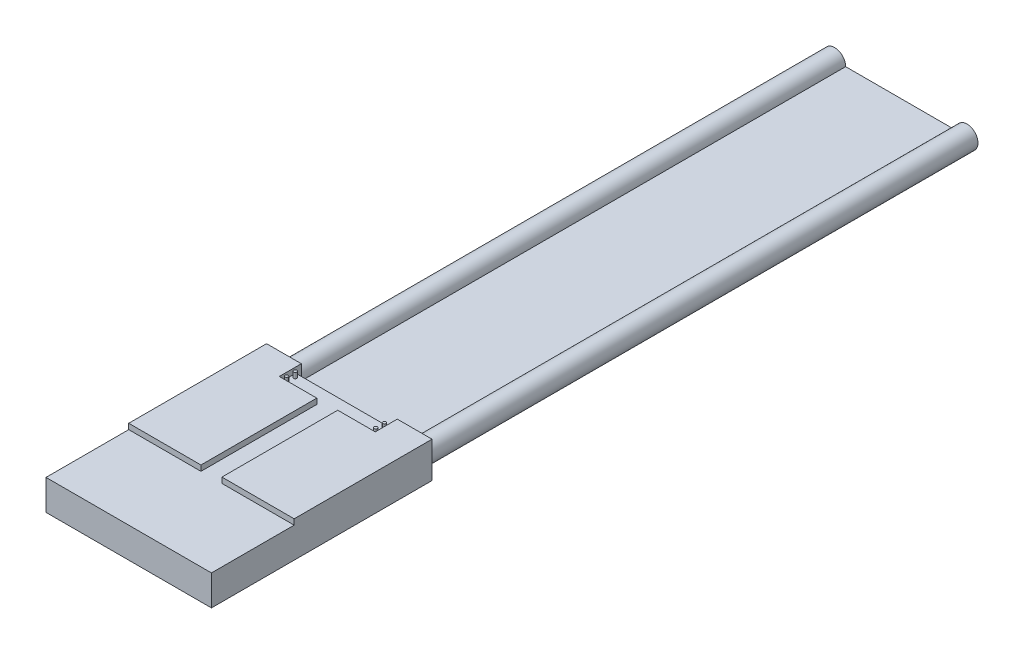
ISO-10303-21;
HEADER;
FILE_DESCRIPTION(('STEP AP214'),'2;1');
FILE_NAME('part.step','',(''),(''),'','','');
FILE_SCHEMA(('AUTOMOTIVE_DESIGN { 1 0 10303 214 1 1 1 1 }'));
ENDSEC;
DATA;
#1=APPLICATION_CONTEXT('core data for automotive mechanical design processes');
#2=APPLICATION_PROTOCOL_DEFINITION('international standard','automotive_design',2000,#1);
#3=PRODUCT_CONTEXT('',#1,'mechanical');
#4=PRODUCT('Part','Part','',(#3));
#5=PRODUCT_RELATED_PRODUCT_CATEGORY('part','',(#4));
#6=PRODUCT_DEFINITION_FORMATION('','',#4);
#7=PRODUCT_DEFINITION_CONTEXT('part definition',#1,'design');
#8=PRODUCT_DEFINITION('design','',#6,#7);
#9=PRODUCT_DEFINITION_SHAPE('','',#8);
#10=(LENGTH_UNIT() NAMED_UNIT(*) SI_UNIT(.MILLI.,.METRE.));
#11=(NAMED_UNIT(*) PLANE_ANGLE_UNIT() SI_UNIT($,.RADIAN.));
#12=(NAMED_UNIT(*) SI_UNIT($,.STERADIAN.) SOLID_ANGLE_UNIT());
#13=UNCERTAINTY_MEASURE_WITH_UNIT(LENGTH_MEASURE(1.E-05),#10,'distance_accuracy_value','');
#14=(GEOMETRIC_REPRESENTATION_CONTEXT(3) GLOBAL_UNCERTAINTY_ASSIGNED_CONTEXT((#13)) GLOBAL_UNIT_ASSIGNED_CONTEXT((#10,
#11,#12)) REPRESENTATION_CONTEXT('',''));
#15=CARTESIAN_POINT('',(0.,0.,0.));
#16=DIRECTION('',(0.,0.,1.));
#17=DIRECTION('',(1.,0.,0.));
#18=AXIS2_PLACEMENT_3D('',#15,#16,#17);
#19=CARTESIAN_POINT('',(0.,0.,0.));
#20=DIRECTION('',(0.,0.,1.));
#21=DIRECTION('',(1.,0.,0.));
#22=AXIS2_PLACEMENT_3D('',#19,#20,#21);
#23=PLANE('',#22);
#24=DIRECTION('',(-1.,0.,0.));
#25=VECTOR('',#24,1.);
#26=CARTESIAN_POINT('',(-30.,5.5,0.));
#27=LINE('',#26,#25);
#28=CARTESIAN_POINT('',(0.,5.5,0.));
#29=VERTEX_POINT('',#28);
#30=CARTESIAN_POINT('',(-13.1,5.5,0.));
#31=VERTEX_POINT('',#30);
#32=EDGE_CURVE('E130',#29,#31,#27,.T.);
#33=ORIENTED_EDGE('',*,*,#32,.F.);
#34=DIRECTION('',(0.,1.,0.));
#35=VECTOR('',#34,1.);
#36=CARTESIAN_POINT('',(0.,5.50000000000001,0.));
#37=LINE('',#36,#35);
#38=CARTESIAN_POINT('',(0.,6.50000000000001,0.));
#39=VERTEX_POINT('',#38);
#40=EDGE_CURVE('E455',#29,#39,#37,.T.);
#41=ORIENTED_EDGE('',*,*,#40,.T.);
#42=DIRECTION('',(1.,0.,0.));
#43=VECTOR('',#42,1.);
#44=CARTESIAN_POINT('',(0.,6.50000000000001,0.));
#45=LINE('',#44,#43);
#46=CARTESIAN_POINT('',(-13.1,6.5,0.));
#47=VERTEX_POINT('',#46);
#48=EDGE_CURVE('E384',#47,#39,#45,.T.);
#49=ORIENTED_EDGE('',*,*,#48,.F.);
#50=DIRECTION('',(0.,-1.,0.));
#51=VECTOR('',#50,1.);
#52=CARTESIAN_POINT('',(-13.1,6.5,0.));
#53=LINE('',#52,#51);
#54=EDGE_CURVE('E397',#47,#31,#53,.T.);
#55=ORIENTED_EDGE('',*,*,#54,.T.);
#56=EDGE_LOOP('',(#33,#41,#49,#55));
#57=FACE_BOUND('',#56,.T.);
#58=ADVANCED_FACE('F119',(#57),#23,.T.);
#59=CARTESIAN_POINT('',(-30.,5.5,-25.));
#60=DIRECTION('',(0.,1.,0.));
#61=DIRECTION('',(-1.,0.,0.));
#62=AXIS2_PLACEMENT_3D('',#59,#60,#61);
#63=PLANE('',#62);
#64=CARTESIAN_POINT('',(-6.9125,5.5,-21.7125));
#65=DIRECTION('',(0.,1.,0.));
#66=DIRECTION('',(-1.,0.,0.));
#67=AXIS2_PLACEMENT_3D('',#64,#65,#66);
#68=CIRCLE('',#67,0.287500000000001);
#69=CARTESIAN_POINT('',(-7.2,5.5,-21.7125));
#70=VERTEX_POINT('',#69);
#71=EDGE_CURVE('E318',#70,#70,#68,.T.);
#72=ORIENTED_EDGE('',*,*,#71,.F.);
#73=EDGE_LOOP('',(#72));
#74=FACE_BOUND('',#73,.T.);
#75=CARTESIAN_POINT('',(-6.9125,5.5,-23.2875));
#76=DIRECTION('',(0.,1.,0.));
#77=DIRECTION('',(-1.,0.,0.));
#78=AXIS2_PLACEMENT_3D('',#75,#76,#77);
#79=CIRCLE('',#78,0.287500000000001);
#80=CARTESIAN_POINT('',(-7.2,5.5,-23.2875));
#81=VERTEX_POINT('',#80);
#82=EDGE_CURVE('E324',#81,#81,#79,.T.);
#83=ORIENTED_EDGE('',*,*,#82,.F.);
#84=EDGE_LOOP('',(#83));
#85=FACE_BOUND('',#84,.T.);
#86=CARTESIAN_POINT('',(-23.0875,5.5,-23.2875));
#87=DIRECTION('',(0.,1.,0.));
#88=DIRECTION('',(-1.,0.,0.));
#89=AXIS2_PLACEMENT_3D('',#86,#87,#88);
#90=CIRCLE('',#89,0.287500000000004);
#91=CARTESIAN_POINT('',(-23.375,5.5,-23.2875));
#92=VERTEX_POINT('',#91);
#93=EDGE_CURVE('E330',#92,#92,#90,.T.);
#94=ORIENTED_EDGE('',*,*,#93,.F.);
#95=EDGE_LOOP('',(#94));
#96=FACE_BOUND('',#95,.T.);
#97=CARTESIAN_POINT('',(-23.0875,5.5,-21.7125));
#98=DIRECTION('',(0.,1.,0.));
#99=DIRECTION('',(-1.,0.,0.));
#100=AXIS2_PLACEMENT_3D('',#97,#98,#99);
#101=CIRCLE('',#100,0.287500000000004);
#102=CARTESIAN_POINT('',(-23.375,5.5,-21.7125));
#103=VERTEX_POINT('',#102);
#104=EDGE_CURVE('E336',#103,#103,#101,.T.);
#105=ORIENTED_EDGE('',*,*,#104,.F.);
#106=EDGE_LOOP('',(#105));
#107=FACE_BOUND('',#106,.T.);
#108=DIRECTION('',(0.,0.,-1.));
#109=VECTOR('',#108,1.);
#110=CARTESIAN_POINT('',(-6.3,5.5,0.));
#111=LINE('',#110,#109);
#112=CARTESIAN_POINT('',(-6.3,5.5,-21.));
#113=VERTEX_POINT('',#112);
#114=CARTESIAN_POINT('',(-6.3,5.5,-24.));
#115=VERTEX_POINT('',#114);
#116=EDGE_CURVE('E361',#113,#115,#111,.T.);
#117=ORIENTED_EDGE('',*,*,#116,.T.);
#118=DIRECTION('',(-1.,0.,0.));
#119=VECTOR('',#118,1.);
#120=CARTESIAN_POINT('',(0.,5.50000000000001,-24.));
#121=LINE('',#120,#119);
#122=CARTESIAN_POINT('',(-23.7,5.5,-24.));
#123=VERTEX_POINT('',#122);
#124=EDGE_CURVE('E302',#115,#123,#121,.T.);
#125=ORIENTED_EDGE('',*,*,#124,.T.);
#126=DIRECTION('',(0.,0.,-1.));
#127=VECTOR('',#126,1.);
#128=CARTESIAN_POINT('',(-23.7,5.5,0.));
#129=LINE('',#128,#127);
#130=CARTESIAN_POINT('',(-23.7,5.5,-21.));
#131=VERTEX_POINT('',#130);
#132=EDGE_CURVE('E358',#131,#123,#129,.T.);
#133=ORIENTED_EDGE('',*,*,#132,.F.);
#134=DIRECTION('',(-1.,0.,0.));
#135=VECTOR('',#134,1.);
#136=CARTESIAN_POINT('',(0.,5.50000000000001,-21.));
#137=LINE('',#136,#135);
#138=CARTESIAN_POINT('',(-16.9,5.5,-21.));
#139=VERTEX_POINT('',#138);
#140=EDGE_CURVE('E353',#139,#131,#137,.T.);
#141=ORIENTED_EDGE('',*,*,#140,.F.);
#142=DIRECTION('',(0.,0.,-1.));
#143=VECTOR('',#142,1.);
#144=CARTESIAN_POINT('',(-16.9,5.5,0.));
#145=LINE('',#144,#143);
#146=CARTESIAN_POINT('',(-16.9,5.5,0.));
#147=VERTEX_POINT('',#146);
#148=EDGE_CURVE('E355',#147,#139,#145,.T.);
#149=ORIENTED_EDGE('',*,*,#148,.F.);
#150=CARTESIAN_POINT('',(-30.,5.5,0.));
#151=VERTEX_POINT('',#150);
#152=EDGE_CURVE('E12',#147,#151,#27,.T.);
#153=ORIENTED_EDGE('',*,*,#152,.T.);
#154=DIRECTION('',(0.,0.,-1.));
#155=VECTOR('',#154,1.);
#156=CARTESIAN_POINT('',(-30.,5.5,15.));
#157=LINE('',#156,#155);
#158=CARTESIAN_POINT('',(-30.,5.5,15.));
#159=VERTEX_POINT('',#158);
#160=EDGE_CURVE('E296',#159,#151,#157,.T.);
#161=ORIENTED_EDGE('',*,*,#160,.F.);
#162=DIRECTION('',(-1.,0.,0.));
#163=VECTOR('',#162,1.);
#164=CARTESIAN_POINT('',(-30.,5.5,15.));
#165=LINE('',#164,#163);
#166=CARTESIAN_POINT('',(0.,5.50000000000001,15.));
#167=VERTEX_POINT('',#166);
#168=EDGE_CURVE('E291',#167,#159,#165,.T.);
#169=ORIENTED_EDGE('',*,*,#168,.F.);
#170=DIRECTION('',(0.,0.,-1.));
#171=VECTOR('',#170,1.);
#172=CARTESIAN_POINT('',(0.,5.50000000000001,15.));
#173=LINE('',#172,#171);
#174=EDGE_CURVE('E299',#167,#29,#173,.T.);
#175=ORIENTED_EDGE('',*,*,#174,.T.);
#176=ORIENTED_EDGE('',*,*,#32,.T.);
#177=DIRECTION('',(0.,0.,-1.));
#178=VECTOR('',#177,1.);
#179=CARTESIAN_POINT('',(-13.1,5.5,0.));
#180=LINE('',#179,#178);
#181=CARTESIAN_POINT('',(-13.1,5.5,-21.));
#182=VERTEX_POINT('',#181);
#183=EDGE_CURVE('E379',#31,#182,#180,.T.);
#184=ORIENTED_EDGE('',*,*,#183,.T.);
#185=DIRECTION('',(-1.,0.,0.));
#186=VECTOR('',#185,1.);
#187=CARTESIAN_POINT('',(0.,5.50000000000001,-21.));
#188=LINE('',#187,#186);
#189=EDGE_CURVE('E144',#113,#182,#188,.T.);
#190=ORIENTED_EDGE('',*,*,#189,.F.);
#191=EDGE_LOOP('',(#117,#125,#133,#141,#149,#153,#161,#169,#175,#176,#184,#190));
#192=FACE_BOUND('',#191,.T.);
#193=ADVANCED_FACE('F485',(#74,#85,#96,#107,#192),#63,.T.);
#194=CARTESIAN_POINT('',(0.,0.,-25.));
#195=DIRECTION('',(0.,0.,1.));
#196=DIRECTION('',(1.,0.,0.));
#197=AXIS2_PLACEMENT_3D('',#194,#195,#196);
#198=PLANE('',#197);
#199=DIRECTION('',(0.,-1.,0.));
#200=VECTOR('',#199,1.);
#201=CARTESIAN_POINT('',(-23.7,6.5,-25.));
#202=LINE('',#201,#200);
#203=CARTESIAN_POINT('',(-23.7,6.5,-25.));
#204=VERTEX_POINT('',#203);
#205=CARTESIAN_POINT('',(-23.7,2.5,-25.));
#206=VERTEX_POINT('',#205);
#207=EDGE_CURVE('E339',#204,#206,#202,.T.);
#208=ORIENTED_EDGE('',*,*,#207,.T.);
#209=DIRECTION('',(-1.,0.,0.));
#210=VECTOR('',#209,1.);
#211=CARTESIAN_POINT('',(0.,2.5,-25.));
#212=LINE('',#211,#210);
#213=CARTESIAN_POINT('',(-25.,2.5,-25.));
#214=VERTEX_POINT('',#213);
#215=EDGE_CURVE('E432',#206,#214,#212,.T.);
#216=ORIENTED_EDGE('',*,*,#215,.T.);
#217=CARTESIAN_POINT('',(-27.,2.5,-25.));
#218=DIRECTION('',(0.,0.,-1.));
#219=DIRECTION('',(-1.,0.,0.));
#220=AXIS2_PLACEMENT_3D('',#217,#218,#219);
#221=CIRCLE('',#220,2.);
#222=CARTESIAN_POINT('',(-26.9847056428295,0.500058480195299,-25.));
#223=VERTEX_POINT('',#222);
#224=EDGE_CURVE('E429',#223,#214,#221,.T.);
#225=ORIENTED_EDGE('',*,*,#224,.F.);
#226=DIRECTION('',(0.,-1.,0.));
#227=VECTOR('',#226,1.);
#228=CARTESIAN_POINT('',(-26.9847056428295,0.,-25.));
#229=LINE('',#228,#227);
#230=CARTESIAN_POINT('',(-26.9847056428295,0.,-25.));
#231=VERTEX_POINT('',#230);
#232=EDGE_CURVE('E427',#223,#231,#229,.T.);
#233=ORIENTED_EDGE('',*,*,#232,.T.);
#234=DIRECTION('',(1.,0.,0.));
#235=VECTOR('',#234,1.);
#236=CARTESIAN_POINT('',(-30.,0.,-25.));
#237=LINE('',#236,#235);
#238=CARTESIAN_POINT('',(-30.,0.,-25.));
#239=VERTEX_POINT('',#238);
#240=EDGE_CURVE('E456',#239,#231,#237,.T.);
#241=ORIENTED_EDGE('',*,*,#240,.F.);
#242=DIRECTION('',(0.,-1.,0.));
#243=VECTOR('',#242,1.);
#244=CARTESIAN_POINT('',(-30.,5.5,-25.));
#245=LINE('',#244,#243);
#246=CARTESIAN_POINT('',(-30.,6.5,-25.));
#247=VERTEX_POINT('',#246);
#248=EDGE_CURVE('E276',#247,#239,#245,.T.);
#249=ORIENTED_EDGE('',*,*,#248,.F.);
#250=DIRECTION('',(-1.,0.,0.));
#251=VECTOR('',#250,1.);
#252=CARTESIAN_POINT('',(0.,6.50000000000001,-25.));
#253=LINE('',#252,#251);
#254=EDGE_CURVE('E370',#204,#247,#253,.T.);
#255=ORIENTED_EDGE('',*,*,#254,.F.);
#256=EDGE_LOOP('',(#208,#216,#225,#233,#241,#249,#255));
#257=FACE_BOUND('',#256,.T.);
#258=ADVANCED_FACE('F511',(#257),#198,.F.);
#259=CARTESIAN_POINT('',(-30.,5.5,-25.));
#260=DIRECTION('',(-1.,0.,0.));
#261=DIRECTION('',(0.,0.,1.));
#262=AXIS2_PLACEMENT_3D('',#259,#260,#261);
#263=PLANE('',#262);
#264=DIRECTION('',(0.,-1.,0.));
#265=VECTOR('',#264,1.);
#266=CARTESIAN_POINT('',(-30.,5.5,0.));
#267=LINE('',#266,#265);
#268=CARTESIAN_POINT('',(-30.,6.5,0.));
#269=VERTEX_POINT('',#268);
#270=EDGE_CURVE('E452',#269,#151,#267,.T.);
#271=ORIENTED_EDGE('',*,*,#270,.F.);
#272=DIRECTION('',(0.,0.,1.));
#273=VECTOR('',#272,1.);
#274=CARTESIAN_POINT('',(-30.,6.5,0.));
#275=LINE('',#274,#273);
#276=EDGE_CURVE('E367',#247,#269,#275,.T.);
#277=ORIENTED_EDGE('',*,*,#276,.F.);
#278=ORIENTED_EDGE('',*,*,#248,.T.);
#279=DIRECTION('',(0.,0.,1.));
#280=VECTOR('',#279,1.);
#281=CARTESIAN_POINT('',(-30.,0.,-25.));
#282=LINE('',#281,#280);
#283=CARTESIAN_POINT('',(-30.,0.,15.));
#284=VERTEX_POINT('',#283);
#285=EDGE_CURVE('E123',#239,#284,#282,.T.);
#286=ORIENTED_EDGE('',*,*,#285,.T.);
#287=DIRECTION('',(0.,-1.,0.));
#288=VECTOR('',#287,1.);
#289=CARTESIAN_POINT('',(-30.,5.5,15.));
#290=LINE('',#289,#288);
#291=EDGE_CURVE('E274',#159,#284,#290,.T.);
#292=ORIENTED_EDGE('',*,*,#291,.F.);
#293=ORIENTED_EDGE('',*,*,#160,.T.);
#294=EDGE_LOOP('',(#271,#277,#278,#286,#292,#293));
#295=FACE_BOUND('',#294,.T.);
#296=ADVANCED_FACE('F121',(#295),#263,.T.);
#297=CARTESIAN_POINT('',(0.,5.50000000000001,-25.));
#298=DIRECTION('',(1.,0.,0.));
#299=DIRECTION('',(0.,0.,-1.));
#300=AXIS2_PLACEMENT_3D('',#297,#298,#299);
#301=PLANE('',#300);
#302=ORIENTED_EDGE('',*,*,#40,.F.);
#303=ORIENTED_EDGE('',*,*,#174,.F.);
#304=DIRECTION('',(0.,1.,0.));
#305=VECTOR('',#304,1.);
#306=CARTESIAN_POINT('',(0.,5.50000000000001,15.));
#307=LINE('',#306,#305);
#308=CARTESIAN_POINT('',(0.,0.,15.));
#309=VERTEX_POINT('',#308);
#310=EDGE_CURVE('E287',#309,#167,#307,.T.);
#311=ORIENTED_EDGE('',*,*,#310,.F.);
#312=DIRECTION('',(0.,0.,1.));
#313=VECTOR('',#312,1.);
#314=CARTESIAN_POINT('',(0.,0.,-25.));
#315=LINE('',#314,#313);
#316=CARTESIAN_POINT('',(0.,0.,-25.));
#317=VERTEX_POINT('',#316);
#318=EDGE_CURVE('E128',#317,#309,#315,.T.);
#319=ORIENTED_EDGE('',*,*,#318,.F.);
#320=DIRECTION('',(0.,1.,0.));
#321=VECTOR('',#320,1.);
#322=CARTESIAN_POINT('',(0.,5.50000000000001,-25.));
#323=LINE('',#322,#321);
#324=CARTESIAN_POINT('',(0.,6.50000000000001,-25.));
#325=VERTEX_POINT('',#324);
#326=EDGE_CURVE('E280',#317,#325,#323,.T.);
#327=ORIENTED_EDGE('',*,*,#326,.T.);
#328=DIRECTION('',(0.,0.,-1.));
#329=VECTOR('',#328,1.);
#330=CARTESIAN_POINT('',(0.,6.50000000000001,0.));
#331=LINE('',#330,#329);
#332=EDGE_CURVE('E387',#39,#325,#331,.T.);
#333=ORIENTED_EDGE('',*,*,#332,.F.);
#334=EDGE_LOOP('',(#302,#303,#311,#319,#327,#333));
#335=FACE_BOUND('',#334,.T.);
#336=ADVANCED_FACE('F469',(#335),#301,.T.);
#337=CARTESIAN_POINT('',(-30.,0.,-25.));
#338=DIRECTION('',(0.,-1.,0.));
#339=DIRECTION('',(0.,0.,-1.));
#340=AXIS2_PLACEMENT_3D('',#337,#338,#339);
#341=PLANE('',#340);
#342=ORIENTED_EDGE('',*,*,#318,.T.);
#343=DIRECTION('',(1.,0.,0.));
#344=VECTOR('',#343,1.);
#345=CARTESIAN_POINT('',(-30.,0.,15.));
#346=LINE('',#345,#344);
#347=EDGE_CURVE('E282',#284,#309,#346,.T.);
#348=ORIENTED_EDGE('',*,*,#347,.F.);
#349=ORIENTED_EDGE('',*,*,#285,.F.);
#350=ORIENTED_EDGE('',*,*,#240,.T.);
#351=DIRECTION('',(0.,0.,1.));
#352=VECTOR('',#351,1.);
#353=CARTESIAN_POINT('',(-26.9847056428295,0.,-125.));
#354=LINE('',#353,#352);
#355=CARTESIAN_POINT('',(-26.9847056428295,0.,-125.));
#356=VERTEX_POINT('',#355);
#357=EDGE_CURVE('E443',#356,#231,#354,.T.);
#358=ORIENTED_EDGE('',*,*,#357,.F.);
#359=DIRECTION('',(-1.,0.,0.));
#360=VECTOR('',#359,1.);
#361=CARTESIAN_POINT('',(0.,0.,-125.));
#362=LINE('',#361,#360);
#363=CARTESIAN_POINT('',(-3.,0.,-125.));
#364=VERTEX_POINT('',#363);
#365=EDGE_CURVE('E411',#364,#356,#362,.T.);
#366=ORIENTED_EDGE('',*,*,#365,.F.);
#367=DIRECTION('',(0.,0.,1.));
#368=VECTOR('',#367,1.);
#369=CARTESIAN_POINT('',(-3.,0.,-125.));
#370=LINE('',#369,#368);
#371=CARTESIAN_POINT('',(-3.,0.,-25.));
#372=VERTEX_POINT('',#371);
#373=EDGE_CURVE('E446',#364,#372,#370,.T.);
#374=ORIENTED_EDGE('',*,*,#373,.T.);
#375=EDGE_CURVE('E454',#372,#317,#237,.T.);
#376=ORIENTED_EDGE('',*,*,#375,.T.);
#377=EDGE_LOOP('',(#342,#348,#349,#350,#358,#366,#374,#376));
#378=FACE_BOUND('',#377,.T.);
#379=ADVANCED_FACE('F283',(#378),#341,.T.);
#380=CARTESIAN_POINT('',(-5.,2.5,-25.));
#381=VERTEX_POINT('',#380);
#382=CARTESIAN_POINT('',(-6.3,2.5,-25.));
#383=VERTEX_POINT('',#382);
#384=EDGE_CURVE('E409',#381,#383,#212,.T.);
#385=ORIENTED_EDGE('',*,*,#384,.T.);
#386=DIRECTION('',(0.,-1.,0.));
#387=VECTOR('',#386,1.);
#388=CARTESIAN_POINT('',(-6.3,6.5,-25.));
#389=LINE('',#388,#387);
#390=CARTESIAN_POINT('',(-6.3,6.5,-25.));
#391=VERTEX_POINT('',#390);
#392=EDGE_CURVE('E392',#391,#383,#389,.T.);
#393=ORIENTED_EDGE('',*,*,#392,.F.);
#394=DIRECTION('',(-1.,0.,0.));
#395=VECTOR('',#394,1.);
#396=CARTESIAN_POINT('',(0.,6.50000000000001,-25.));
#397=LINE('',#396,#395);
#398=EDGE_CURVE('E390',#325,#391,#397,.T.);
#399=ORIENTED_EDGE('',*,*,#398,.F.);
#400=ORIENTED_EDGE('',*,*,#326,.F.);
#401=ORIENTED_EDGE('',*,*,#375,.F.);
#402=DIRECTION('',(0.,-1.,0.));
#403=VECTOR('',#402,1.);
#404=CARTESIAN_POINT('',(-3.,0.,-25.));
#405=LINE('',#404,#403);
#406=CARTESIAN_POINT('',(-3.,0.5,-25.));
#407=VERTEX_POINT('',#406);
#408=EDGE_CURVE('E424',#407,#372,#405,.T.);
#409=ORIENTED_EDGE('',*,*,#408,.F.);
#410=CARTESIAN_POINT('',(-3.,2.5,-25.));
#411=DIRECTION('',(0.,0.,-1.));
#412=DIRECTION('',(-1.,0.,0.));
#413=AXIS2_PLACEMENT_3D('',#410,#411,#412);
#414=CIRCLE('',#413,2.);
#415=EDGE_CURVE('E404',#381,#407,#414,.T.);
#416=ORIENTED_EDGE('',*,*,#415,.F.);
#417=EDGE_LOOP('',(#385,#393,#399,#400,#401,#409,#416));
#418=FACE_BOUND('',#417,.T.);
#419=ADVANCED_FACE('F472',(#418),#198,.F.);
#420=ORIENTED_EDGE('',*,*,#152,.F.);
#421=DIRECTION('',(0.,-1.,0.));
#422=VECTOR('',#421,1.);
#423=CARTESIAN_POINT('',(-16.9,6.5,0.));
#424=LINE('',#423,#422);
#425=CARTESIAN_POINT('',(-16.9,6.5,0.));
#426=VERTEX_POINT('',#425);
#427=EDGE_CURVE('E343',#426,#147,#424,.T.);
#428=ORIENTED_EDGE('',*,*,#427,.F.);
#429=DIRECTION('',(1.,0.,0.));
#430=VECTOR('',#429,1.);
#431=CARTESIAN_POINT('',(0.,6.50000000000001,0.));
#432=LINE('',#431,#430);
#433=EDGE_CURVE('E365',#269,#426,#432,.T.);
#434=ORIENTED_EDGE('',*,*,#433,.F.);
#435=ORIENTED_EDGE('',*,*,#270,.T.);
#436=EDGE_LOOP('',(#420,#428,#434,#435));
#437=FACE_BOUND('',#436,.T.);
#438=ADVANCED_FACE('F492',(#437),#23,.T.);
#439=CARTESIAN_POINT('',(-3.,2.5,-125.));
#440=DIRECTION('',(0.,0.,1.));
#441=DIRECTION('',(1.,0.,0.));
#442=AXIS2_PLACEMENT_3D('',#439,#440,#441);
#443=CYLINDRICAL_SURFACE('',#442,2.);
#444=ORIENTED_EDGE('',*,*,#415,.T.);
#445=DIRECTION('',(0.,0.,1.));
#446=VECTOR('',#445,1.);
#447=CARTESIAN_POINT('',(-3.,0.5,-125.));
#448=LINE('',#447,#446);
#449=CARTESIAN_POINT('',(-3.,0.5,-125.));
#450=VERTEX_POINT('',#449);
#451=EDGE_CURVE('E449',#450,#407,#448,.T.);
#452=ORIENTED_EDGE('',*,*,#451,.F.);
#453=CARTESIAN_POINT('',(-3.,2.5,-125.));
#454=DIRECTION('',(0.,0.,-1.));
#455=DIRECTION('',(-1.,0.,0.));
#456=AXIS2_PLACEMENT_3D('',#453,#454,#455);
#457=CIRCLE('',#456,2.);
#458=CARTESIAN_POINT('',(-5.,2.5,-125.));
#459=VERTEX_POINT('',#458);
#460=EDGE_CURVE('E405',#459,#450,#457,.T.);
#461=ORIENTED_EDGE('',*,*,#460,.F.);
#462=DIRECTION('',(0.,0.,1.));
#463=VECTOR('',#462,1.);
#464=CARTESIAN_POINT('',(-5.,2.5,-125.));
#465=LINE('',#464,#463);
#466=EDGE_CURVE('E421',#459,#381,#465,.T.);
#467=ORIENTED_EDGE('',*,*,#466,.T.);
#468=EDGE_LOOP('',(#444,#452,#461,#467));
#469=FACE_BOUND('',#468,.T.);
#470=ADVANCED_FACE('F530',(#469),#443,.T.);
#471=CARTESIAN_POINT('',(-3.,0.,-125.));
#472=DIRECTION('',(-1.,0.,0.));
#473=DIRECTION('',(0.,-1.,0.));
#474=AXIS2_PLACEMENT_3D('',#471,#472,#473);
#475=PLANE('',#474);
#476=ORIENTED_EDGE('',*,*,#408,.T.);
#477=ORIENTED_EDGE('',*,*,#373,.F.);
#478=DIRECTION('',(0.,-1.,0.));
#479=VECTOR('',#478,1.);
#480=CARTESIAN_POINT('',(-3.,0.,-125.));
#481=LINE('',#480,#479);
#482=EDGE_CURVE('E408',#450,#364,#481,.T.);
#483=ORIENTED_EDGE('',*,*,#482,.F.);
#484=ORIENTED_EDGE('',*,*,#451,.T.);
#485=EDGE_LOOP('',(#476,#477,#483,#484));
#486=FACE_BOUND('',#485,.T.);
#487=ADVANCED_FACE('F525',(#486),#475,.F.);
#488=CARTESIAN_POINT('',(-26.9847056428295,0.,-125.));
#489=DIRECTION('',(-1.,0.,0.));
#490=DIRECTION('',(0.,0.,1.));
#491=AXIS2_PLACEMENT_3D('',#488,#489,#490);
#492=PLANE('',#491);
#493=ORIENTED_EDGE('',*,*,#232,.F.);
#494=DIRECTION('',(0.,0.,1.));
#495=VECTOR('',#494,1.);
#496=CARTESIAN_POINT('',(-26.9847056428295,0.500058480195299,-125.));
#497=LINE('',#496,#495);
#498=CARTESIAN_POINT('',(-26.9847056428295,0.500058480195299,-125.));
#499=VERTEX_POINT('',#498);
#500=EDGE_CURVE('E440',#499,#223,#497,.T.);
#501=ORIENTED_EDGE('',*,*,#500,.F.);
#502=DIRECTION('',(0.,-1.,0.));
#503=VECTOR('',#502,1.);
#504=CARTESIAN_POINT('',(-26.9847056428295,0.,-125.));
#505=LINE('',#504,#503);
#506=EDGE_CURVE('E413',#499,#356,#505,.T.);
#507=ORIENTED_EDGE('',*,*,#506,.T.);
#508=ORIENTED_EDGE('',*,*,#357,.T.);
#509=EDGE_LOOP('',(#493,#501,#507,#508));
#510=FACE_BOUND('',#509,.T.);
#511=ADVANCED_FACE('F516',(#510),#492,.T.);
#512=CARTESIAN_POINT('',(-27.,2.5,-125.));
#513=DIRECTION('',(0.,0.,1.));
#514=DIRECTION('',(1.,0.,0.));
#515=AXIS2_PLACEMENT_3D('',#512,#513,#514);
#516=CYLINDRICAL_SURFACE('',#515,2.);
#517=ORIENTED_EDGE('',*,*,#224,.T.);
#518=DIRECTION('',(0.,0.,1.));
#519=VECTOR('',#518,1.);
#520=CARTESIAN_POINT('',(-25.,2.5,-125.));
#521=LINE('',#520,#519);
#522=CARTESIAN_POINT('',(-25.,2.5,-125.));
#523=VERTEX_POINT('',#522);
#524=EDGE_CURVE('E437',#523,#214,#521,.T.);
#525=ORIENTED_EDGE('',*,*,#524,.F.);
#526=CARTESIAN_POINT('',(-27.,2.5,-125.));
#527=DIRECTION('',(0.,0.,-1.));
#528=DIRECTION('',(-1.,0.,0.));
#529=AXIS2_PLACEMENT_3D('',#526,#527,#528);
#530=CIRCLE('',#529,2.);
#531=EDGE_CURVE('E416',#499,#523,#530,.T.);
#532=ORIENTED_EDGE('',*,*,#531,.F.);
#533=ORIENTED_EDGE('',*,*,#500,.T.);
#534=EDGE_LOOP('',(#517,#525,#532,#533));
#535=FACE_BOUND('',#534,.T.);
#536=ADVANCED_FACE('F538',(#535),#516,.T.);
#537=CARTESIAN_POINT('',(0.,2.5,-125.));
#538=DIRECTION('',(0.,1.,0.));
#539=DIRECTION('',(0.,0.,1.));
#540=AXIS2_PLACEMENT_3D('',#537,#538,#539);
#541=PLANE('',#540);
#542=ORIENTED_EDGE('',*,*,#384,.F.);
#543=ORIENTED_EDGE('',*,*,#466,.F.);
#544=DIRECTION('',(-1.,0.,0.));
#545=VECTOR('',#544,1.);
#546=CARTESIAN_POINT('',(0.,2.5,-125.));
#547=LINE('',#546,#545);
#548=EDGE_CURVE('E418',#459,#523,#547,.T.);
#549=ORIENTED_EDGE('',*,*,#548,.T.);
#550=ORIENTED_EDGE('',*,*,#524,.T.);
#551=ORIENTED_EDGE('',*,*,#215,.F.);
#552=DIRECTION('',(0.,0.,-1.));
#553=VECTOR('',#552,1.);
#554=CARTESIAN_POINT('',(-23.7,2.5,0.));
#555=LINE('',#554,#553);
#556=CARTESIAN_POINT('',(-23.7,2.5,-24.));
#557=VERTEX_POINT('',#556);
#558=EDGE_CURVE('E303',#557,#206,#555,.T.);
#559=ORIENTED_EDGE('',*,*,#558,.F.);
#560=DIRECTION('',(-1.,0.,0.));
#561=VECTOR('',#560,1.);
#562=CARTESIAN_POINT('',(0.,2.5,-24.));
#563=LINE('',#562,#561);
#564=CARTESIAN_POINT('',(-6.3,2.5,-24.));
#565=VERTEX_POINT('',#564);
#566=EDGE_CURVE('E306',#565,#557,#563,.T.);
#567=ORIENTED_EDGE('',*,*,#566,.F.);
#568=DIRECTION('',(0.,0.,-1.));
#569=VECTOR('',#568,1.);
#570=CARTESIAN_POINT('',(-6.3,2.5,0.));
#571=LINE('',#570,#569);
#572=EDGE_CURVE('E308',#565,#383,#571,.T.);
#573=ORIENTED_EDGE('',*,*,#572,.T.);
#574=EDGE_LOOP('',(#542,#543,#549,#550,#551,#559,#567,#573));
#575=FACE_BOUND('',#574,.T.);
#576=ADVANCED_FACE('F532',(#575),#541,.T.);
#577=CARTESIAN_POINT('',(0.,0.,-125.));
#578=DIRECTION('',(0.,0.,-1.));
#579=DIRECTION('',(-1.,0.,0.));
#580=AXIS2_PLACEMENT_3D('',#577,#578,#579);
#581=PLANE('',#580);
#582=ORIENTED_EDGE('',*,*,#460,.T.);
#583=ORIENTED_EDGE('',*,*,#482,.T.);
#584=ORIENTED_EDGE('',*,*,#365,.T.);
#585=ORIENTED_EDGE('',*,*,#506,.F.);
#586=ORIENTED_EDGE('',*,*,#531,.T.);
#587=ORIENTED_EDGE('',*,*,#548,.F.);
#588=EDGE_LOOP('',(#582,#583,#584,#585,#586,#587));
#589=FACE_BOUND('',#588,.T.);
#590=ADVANCED_FACE('F520',(#589),#581,.T.);
#591=CARTESIAN_POINT('',(-6.3,6.5,0.));
#592=DIRECTION('',(-1.,0.,0.));
#593=DIRECTION('',(0.,-1.,0.));
#594=AXIS2_PLACEMENT_3D('',#591,#592,#593);
#595=PLANE('',#594);
#596=ORIENTED_EDGE('',*,*,#116,.F.);
#597=DIRECTION('',(0.,-1.,0.));
#598=VECTOR('',#597,1.);
#599=CARTESIAN_POINT('',(-6.3,6.5,-21.));
#600=LINE('',#599,#598);
#601=CARTESIAN_POINT('',(-6.3,6.5,-21.));
#602=VERTEX_POINT('',#601);
#603=EDGE_CURVE('E402',#602,#113,#600,.T.);
#604=ORIENTED_EDGE('',*,*,#603,.F.);
#605=DIRECTION('',(0.,0.,-1.));
#606=VECTOR('',#605,1.);
#607=CARTESIAN_POINT('',(-6.3,6.5,0.));
#608=LINE('',#607,#606);
#609=EDGE_CURVE('E375',#602,#391,#608,.T.);
#610=ORIENTED_EDGE('',*,*,#609,.T.);
#611=ORIENTED_EDGE('',*,*,#392,.T.);
#612=ORIENTED_EDGE('',*,*,#572,.F.);
#613=DIRECTION('',(0.,1.,0.));
#614=VECTOR('',#613,1.);
#615=CARTESIAN_POINT('',(-6.3,2.5,-24.));
#616=LINE('',#615,#614);
#617=EDGE_CURVE('E314',#565,#115,#616,.T.);
#618=ORIENTED_EDGE('',*,*,#617,.T.);
#619=EDGE_LOOP('',(#596,#604,#610,#611,#612,#618));
#620=FACE_BOUND('',#619,.T.);
#621=ADVANCED_FACE('F478',(#620),#595,.T.);
#622=CARTESIAN_POINT('',(0.,6.50000000000001,-21.));
#623=DIRECTION('',(0.,0.,1.));
#624=DIRECTION('',(1.,0.,0.));
#625=AXIS2_PLACEMENT_3D('',#622,#623,#624);
#626=PLANE('',#625);
#627=ORIENTED_EDGE('',*,*,#189,.T.);
#628=DIRECTION('',(0.,-1.,0.));
#629=VECTOR('',#628,1.);
#630=CARTESIAN_POINT('',(-13.1,6.5,-21.));
#631=LINE('',#630,#629);
#632=CARTESIAN_POINT('',(-13.1,6.5,-21.));
#633=VERTEX_POINT('',#632);
#634=EDGE_CURVE('E399',#633,#182,#631,.T.);
#635=ORIENTED_EDGE('',*,*,#634,.F.);
#636=DIRECTION('',(-1.,0.,0.));
#637=VECTOR('',#636,1.);
#638=CARTESIAN_POINT('',(0.,6.50000000000001,-21.));
#639=LINE('',#638,#637);
#640=EDGE_CURVE('E378',#602,#633,#639,.T.);
#641=ORIENTED_EDGE('',*,*,#640,.F.);
#642=ORIENTED_EDGE('',*,*,#603,.T.);
#643=EDGE_LOOP('',(#627,#635,#641,#642));
#644=FACE_BOUND('',#643,.T.);
#645=ADVANCED_FACE('F481',(#644),#626,.F.);
#646=CARTESIAN_POINT('',(-13.1,6.5,0.));
#647=DIRECTION('',(-1.,0.,0.));
#648=DIRECTION('',(0.,-1.,0.));
#649=AXIS2_PLACEMENT_3D('',#646,#647,#648);
#650=PLANE('',#649);
#651=ORIENTED_EDGE('',*,*,#183,.F.);
#652=ORIENTED_EDGE('',*,*,#54,.F.);
#653=DIRECTION('',(0.,0.,-1.));
#654=VECTOR('',#653,1.);
#655=CARTESIAN_POINT('',(-13.1,6.5,0.));
#656=LINE('',#655,#654);
#657=EDGE_CURVE('E381',#47,#633,#656,.T.);
#658=ORIENTED_EDGE('',*,*,#657,.T.);
#659=ORIENTED_EDGE('',*,*,#634,.T.);
#660=EDGE_LOOP('',(#651,#652,#658,#659));
#661=FACE_BOUND('',#660,.T.);
#662=ADVANCED_FACE('F484',(#661),#650,.T.);
#663=CARTESIAN_POINT('',(0.,6.50000000000001,0.));
#664=DIRECTION('',(0.,1.,0.));
#665=DIRECTION('',(-1.,0.,0.));
#666=AXIS2_PLACEMENT_3D('',#663,#664,#665);
#667=PLANE('',#666);
#668=ORIENTED_EDGE('',*,*,#609,.F.);
#669=ORIENTED_EDGE('',*,*,#640,.T.);
#670=ORIENTED_EDGE('',*,*,#657,.F.);
#671=ORIENTED_EDGE('',*,*,#48,.T.);
#672=ORIENTED_EDGE('',*,*,#332,.T.);
#673=ORIENTED_EDGE('',*,*,#398,.T.);
#674=EDGE_LOOP('',(#668,#669,#670,#671,#672,#673));
#675=FACE_BOUND('',#674,.T.);
#676=ADVANCED_FACE('F467',(#675),#667,.T.);
#677=CARTESIAN_POINT('',(-23.7,6.5,0.));
#678=DIRECTION('',(-1.,0.,0.));
#679=DIRECTION('',(0.,-1.,0.));
#680=AXIS2_PLACEMENT_3D('',#677,#678,#679);
#681=PLANE('',#680);
#682=ORIENTED_EDGE('',*,*,#132,.T.);
#683=DIRECTION('',(0.,1.,0.));
#684=VECTOR('',#683,1.);
#685=CARTESIAN_POINT('',(-23.7,2.5,-24.));
#686=LINE('',#685,#684);
#687=EDGE_CURVE('E311',#557,#123,#686,.T.);
#688=ORIENTED_EDGE('',*,*,#687,.F.);
#689=ORIENTED_EDGE('',*,*,#558,.T.);
#690=ORIENTED_EDGE('',*,*,#207,.F.);
#691=DIRECTION('',(0.,0.,-1.));
#692=VECTOR('',#691,1.);
#693=CARTESIAN_POINT('',(-23.7,6.5,0.));
#694=LINE('',#693,#692);
#695=CARTESIAN_POINT('',(-23.7,6.5,-21.));
#696=VERTEX_POINT('',#695);
#697=EDGE_CURVE('E356',#696,#204,#694,.T.);
#698=ORIENTED_EDGE('',*,*,#697,.F.);
#699=DIRECTION('',(0.,-1.,0.));
#700=VECTOR('',#699,1.);
#701=CARTESIAN_POINT('',(-23.7,6.5,-21.));
#702=LINE('',#701,#700);
#703=EDGE_CURVE('E349',#696,#131,#702,.T.);
#704=ORIENTED_EDGE('',*,*,#703,.T.);
#705=EDGE_LOOP('',(#682,#688,#689,#690,#698,#704));
#706=FACE_BOUND('',#705,.T.);
#707=ADVANCED_FACE('F506',(#706),#681,.F.);
#708=CARTESIAN_POINT('',(-16.9,6.5,0.));
#709=DIRECTION('',(-1.,0.,0.));
#710=DIRECTION('',(0.,-1.,0.));
#711=AXIS2_PLACEMENT_3D('',#708,#709,#710);
#712=PLANE('',#711);
#713=ORIENTED_EDGE('',*,*,#148,.T.);
#714=DIRECTION('',(0.,-1.,0.));
#715=VECTOR('',#714,1.);
#716=CARTESIAN_POINT('',(-16.9,6.5,-21.));
#717=LINE('',#716,#715);
#718=CARTESIAN_POINT('',(-16.9,6.5,-21.));
#719=VERTEX_POINT('',#718);
#720=EDGE_CURVE('E346',#719,#139,#717,.T.);
#721=ORIENTED_EDGE('',*,*,#720,.F.);
#722=DIRECTION('',(0.,0.,-1.));
#723=VECTOR('',#722,1.);
#724=CARTESIAN_POINT('',(-16.9,6.5,0.));
#725=LINE('',#724,#723);
#726=EDGE_CURVE('E363',#426,#719,#725,.T.);
#727=ORIENTED_EDGE('',*,*,#726,.F.);
#728=ORIENTED_EDGE('',*,*,#427,.T.);
#729=EDGE_LOOP('',(#713,#721,#727,#728));
#730=FACE_BOUND('',#729,.T.);
#731=ADVANCED_FACE('F496',(#730),#712,.F.);
#732=CARTESIAN_POINT('',(0.,6.50000000000001,-21.));
#733=DIRECTION('',(0.,0.,1.));
#734=DIRECTION('',(1.,0.,0.));
#735=AXIS2_PLACEMENT_3D('',#732,#733,#734);
#736=PLANE('',#735);
#737=ORIENTED_EDGE('',*,*,#140,.T.);
#738=ORIENTED_EDGE('',*,*,#703,.F.);
#739=DIRECTION('',(-1.,0.,0.));
#740=VECTOR('',#739,1.);
#741=CARTESIAN_POINT('',(0.,6.50000000000001,-21.));
#742=LINE('',#741,#740);
#743=EDGE_CURVE('E352',#719,#696,#742,.T.);
#744=ORIENTED_EDGE('',*,*,#743,.F.);
#745=ORIENTED_EDGE('',*,*,#720,.T.);
#746=EDGE_LOOP('',(#737,#738,#744,#745));
#747=FACE_BOUND('',#746,.T.);
#748=ADVANCED_FACE('F502',(#747),#736,.F.);
#749=CARTESIAN_POINT('',(0.,6.50000000000001,0.));
#750=DIRECTION('',(0.,1.,0.));
#751=DIRECTION('',(-1.,0.,0.));
#752=AXIS2_PLACEMENT_3D('',#749,#750,#751);
#753=PLANE('',#752);
#754=ORIENTED_EDGE('',*,*,#697,.T.);
#755=ORIENTED_EDGE('',*,*,#254,.T.);
#756=ORIENTED_EDGE('',*,*,#276,.T.);
#757=ORIENTED_EDGE('',*,*,#433,.T.);
#758=ORIENTED_EDGE('',*,*,#726,.T.);
#759=ORIENTED_EDGE('',*,*,#743,.T.);
#760=EDGE_LOOP('',(#754,#755,#756,#757,#758,#759));
#761=FACE_BOUND('',#760,.T.);
#762=ADVANCED_FACE('F490',(#761),#753,.T.);
#763=CARTESIAN_POINT('',(-23.0875,6.5,-21.7125));
#764=DIRECTION('',(0.,-1.,0.));
#765=DIRECTION('',(1.,0.,0.));
#766=AXIS2_PLACEMENT_3D('',#763,#764,#765);
#767=CYLINDRICAL_SURFACE('',#766,0.287500000000004);
#768=CARTESIAN_POINT('',(-23.0875,6.5,-21.7125));
#769=DIRECTION('',(0.,1.,0.));
#770=DIRECTION('',(-1.,0.,0.));
#771=AXIS2_PLACEMENT_3D('',#768,#769,#770);
#772=CIRCLE('',#771,0.287500000000004);
#773=CARTESIAN_POINT('',(-23.375,6.5,-21.7125));
#774=VERTEX_POINT('',#773);
#775=EDGE_CURVE('E333',#774,#774,#772,.T.);
#776=ORIENTED_EDGE('',*,*,#775,.F.);
#777=EDGE_LOOP('',(#776));
#778=FACE_BOUND('',#777,.T.);
#779=ORIENTED_EDGE('',*,*,#104,.T.);
#780=EDGE_LOOP('',(#779));
#781=FACE_BOUND('',#780,.T.);
#782=ADVANCED_FACE('F681',(#778,#781),#767,.T.);
#783=CARTESIAN_POINT('',(0.,6.50000000000001,0.));
#784=DIRECTION('',(0.,1.,0.));
#785=DIRECTION('',(-1.,0.,0.));
#786=AXIS2_PLACEMENT_3D('',#783,#784,#785);
#787=PLANE('',#786);
#788=ORIENTED_EDGE('',*,*,#775,.T.);
#789=EDGE_LOOP('',(#788));
#790=FACE_BOUND('',#789,.T.);
#791=ADVANCED_FACE('F673',(#790),#787,.T.);
#792=CARTESIAN_POINT('',(-23.0875,6.5,-23.2875));
#793=DIRECTION('',(0.,-1.,0.));
#794=DIRECTION('',(1.,0.,0.));
#795=AXIS2_PLACEMENT_3D('',#792,#793,#794);
#796=CYLINDRICAL_SURFACE('',#795,0.287500000000004);
#797=CARTESIAN_POINT('',(-23.0875,6.5,-23.2875));
#798=DIRECTION('',(0.,1.,0.));
#799=DIRECTION('',(-1.,0.,0.));
#800=AXIS2_PLACEMENT_3D('',#797,#798,#799);
#801=CIRCLE('',#800,0.287500000000004);
#802=CARTESIAN_POINT('',(-23.375,6.5,-23.2875));
#803=VERTEX_POINT('',#802);
#804=EDGE_CURVE('E327',#803,#803,#801,.T.);
#805=ORIENTED_EDGE('',*,*,#804,.F.);
#806=EDGE_LOOP('',(#805));
#807=FACE_BOUND('',#806,.T.);
#808=ORIENTED_EDGE('',*,*,#93,.T.);
#809=EDGE_LOOP('',(#808));
#810=FACE_BOUND('',#809,.T.);
#811=ADVANCED_FACE('F665',(#807,#810),#796,.T.);
#812=CARTESIAN_POINT('',(0.,6.50000000000001,0.));
#813=DIRECTION('',(0.,1.,0.));
#814=DIRECTION('',(-1.,0.,0.));
#815=AXIS2_PLACEMENT_3D('',#812,#813,#814);
#816=PLANE('',#815);
#817=ORIENTED_EDGE('',*,*,#804,.T.);
#818=EDGE_LOOP('',(#817));
#819=FACE_BOUND('',#818,.T.);
#820=ADVANCED_FACE('F657',(#819),#816,.T.);
#821=CARTESIAN_POINT('',(-6.9125,6.5,-23.2875));
#822=DIRECTION('',(0.,-1.,0.));
#823=DIRECTION('',(1.,0.,0.));
#824=AXIS2_PLACEMENT_3D('',#821,#822,#823);
#825=CYLINDRICAL_SURFACE('',#824,0.287500000000001);
#826=CARTESIAN_POINT('',(-6.9125,6.5,-23.2875));
#827=DIRECTION('',(0.,1.,0.));
#828=DIRECTION('',(-1.,0.,0.));
#829=AXIS2_PLACEMENT_3D('',#826,#827,#828);
#830=CIRCLE('',#829,0.287500000000001);
#831=CARTESIAN_POINT('',(-7.2,6.5,-23.2875));
#832=VERTEX_POINT('',#831);
#833=EDGE_CURVE('E321',#832,#832,#830,.T.);
#834=ORIENTED_EDGE('',*,*,#833,.F.);
#835=EDGE_LOOP('',(#834));
#836=FACE_BOUND('',#835,.T.);
#837=ORIENTED_EDGE('',*,*,#82,.T.);
#838=EDGE_LOOP('',(#837));
#839=FACE_BOUND('',#838,.T.);
#840=ADVANCED_FACE('F649',(#836,#839),#825,.T.);
#841=CARTESIAN_POINT('',(0.,6.50000000000001,0.));
#842=DIRECTION('',(0.,1.,0.));
#843=DIRECTION('',(-1.,0.,0.));
#844=AXIS2_PLACEMENT_3D('',#841,#842,#843);
#845=PLANE('',#844);
#846=ORIENTED_EDGE('',*,*,#833,.T.);
#847=EDGE_LOOP('',(#846));
#848=FACE_BOUND('',#847,.T.);
#849=ADVANCED_FACE('F641',(#848),#845,.T.);
#850=CARTESIAN_POINT('',(-6.9125,6.5,-21.7125));
#851=DIRECTION('',(0.,-1.,0.));
#852=DIRECTION('',(1.,0.,0.));
#853=AXIS2_PLACEMENT_3D('',#850,#851,#852);
#854=CYLINDRICAL_SURFACE('',#853,0.287500000000001);
#855=CARTESIAN_POINT('',(-6.9125,6.5,-21.7125));
#856=DIRECTION('',(0.,1.,0.));
#857=DIRECTION('',(-1.,0.,0.));
#858=AXIS2_PLACEMENT_3D('',#855,#856,#857);
#859=CIRCLE('',#858,0.287500000000001);
#860=CARTESIAN_POINT('',(-7.2,6.5,-21.7125));
#861=VERTEX_POINT('',#860);
#862=EDGE_CURVE('E316',#861,#861,#859,.T.);
#863=ORIENTED_EDGE('',*,*,#862,.F.);
#864=EDGE_LOOP('',(#863));
#865=FACE_BOUND('',#864,.T.);
#866=ORIENTED_EDGE('',*,*,#71,.T.);
#867=EDGE_LOOP('',(#866));
#868=FACE_BOUND('',#867,.T.);
#869=ADVANCED_FACE('F633',(#865,#868),#854,.T.);
#870=CARTESIAN_POINT('',(-6.9125,6.5,-21.7125));
#871=DIRECTION('',(0.,1.,0.));
#872=DIRECTION('',(-1.,0.,0.));
#873=AXIS2_PLACEMENT_3D('',#870,#871,#872);
#874=PLANE('',#873);
#875=ORIENTED_EDGE('',*,*,#862,.T.);
#876=EDGE_LOOP('',(#875));
#877=FACE_BOUND('',#876,.T.);
#878=ADVANCED_FACE('F625',(#877),#874,.T.);
#879=CARTESIAN_POINT('',(0.,2.5,-24.));
#880=DIRECTION('',(0.,0.,-1.));
#881=DIRECTION('',(-1.,0.,0.));
#882=AXIS2_PLACEMENT_3D('',#879,#880,#881);
#883=PLANE('',#882);
#884=ORIENTED_EDGE('',*,*,#124,.F.);
#885=ORIENTED_EDGE('',*,*,#617,.F.);
#886=ORIENTED_EDGE('',*,*,#566,.T.);
#887=ORIENTED_EDGE('',*,*,#687,.T.);
#888=EDGE_LOOP('',(#884,#885,#886,#887));
#889=FACE_BOUND('',#888,.T.);
#890=ADVANCED_FACE('F536',(#889),#883,.T.);
#891=CARTESIAN_POINT('',(0.,0.,15.));
#892=DIRECTION('',(0.,0.,1.));
#893=DIRECTION('',(1.,0.,0.));
#894=AXIS2_PLACEMENT_3D('',#891,#892,#893);
#895=PLANE('',#894);
#896=ORIENTED_EDGE('',*,*,#291,.T.);
#897=ORIENTED_EDGE('',*,*,#347,.T.);
#898=ORIENTED_EDGE('',*,*,#310,.T.);
#899=ORIENTED_EDGE('',*,*,#168,.T.);
#900=EDGE_LOOP('',(#896,#897,#898,#899));
#901=FACE_BOUND('',#900,.T.);
#902=ADVANCED_FACE('F289',(#901),#895,.T.);
#903=CLOSED_SHELL('',(#58,#193,#258,#296,#336,#379,#419,#438,#470,#487,#511,#536,#576,#590,#621,
#645,#662,#676,#707,#731,#748,#762,#782,#791,#811,#820,#840,#849,#869,#878,#890,#902));
#904=MANIFOLD_SOLID_BREP('B2',#903);
#905=ADVANCED_BREP_SHAPE_REPRESENTATION('',(#18,#904),#14);
#906=SHAPE_DEFINITION_REPRESENTATION(#9,#905);
ENDSEC;
END-ISO-10303-21;
